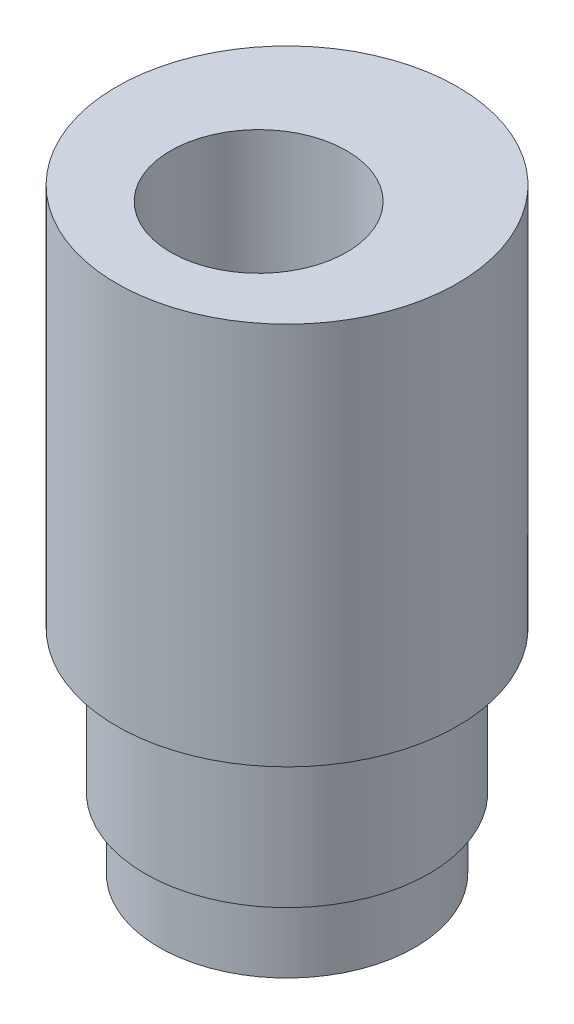
ISO-10303-21;
HEADER;
FILE_DESCRIPTION(('STEP AP214'),'2;1');
FILE_NAME('part.step','',(''),(''),'','','');
FILE_SCHEMA(('AUTOMOTIVE_DESIGN { 1 0 10303 214 1 1 1 1 }'));
ENDSEC;
DATA;
#1=APPLICATION_CONTEXT('core data for automotive mechanical design processes');
#2=APPLICATION_PROTOCOL_DEFINITION('international standard','automotive_design',2000,#1);
#3=PRODUCT_CONTEXT('',#1,'mechanical');
#4=PRODUCT('Part','Part','',(#3));
#5=PRODUCT_RELATED_PRODUCT_CATEGORY('part','',(#4));
#6=PRODUCT_DEFINITION_FORMATION('','',#4);
#7=PRODUCT_DEFINITION_CONTEXT('part definition',#1,'design');
#8=PRODUCT_DEFINITION('design','',#6,#7);
#9=PRODUCT_DEFINITION_SHAPE('','',#8);
#10=(LENGTH_UNIT() NAMED_UNIT(*) SI_UNIT(.MILLI.,.METRE.));
#11=(NAMED_UNIT(*) PLANE_ANGLE_UNIT() SI_UNIT($,.RADIAN.));
#12=(NAMED_UNIT(*) SI_UNIT($,.STERADIAN.) SOLID_ANGLE_UNIT());
#13=UNCERTAINTY_MEASURE_WITH_UNIT(LENGTH_MEASURE(1.E-05),#10,'distance_accuracy_value','');
#14=(GEOMETRIC_REPRESENTATION_CONTEXT(3) GLOBAL_UNCERTAINTY_ASSIGNED_CONTEXT((#13)) GLOBAL_UNIT_ASSIGNED_CONTEXT((#10,
#11,#12)) REPRESENTATION_CONTEXT('',''));
#15=CARTESIAN_POINT('',(0.,0.,0.));
#16=DIRECTION('',(0.,0.,1.));
#17=DIRECTION('',(1.,0.,0.));
#18=AXIS2_PLACEMENT_3D('',#15,#16,#17);
#19=CARTESIAN_POINT('',(0.,7.5,5.));
#20=DIRECTION('',(0.,1.,0.));
#21=DIRECTION('',(0.,0.,1.));
#22=AXIS2_PLACEMENT_3D('',#19,#20,#21);
#23=PLANE('',#22);
#24=CARTESIAN_POINT('',(0.,7.5,0.));
#25=DIRECTION('',(0.,-1.,0.));
#26=DIRECTION('',(0.,0.,-1.));
#27=AXIS2_PLACEMENT_3D('',#24,#25,#26);
#28=CIRCLE('',#27,5.);
#29=CARTESIAN_POINT('',(0.,7.5,-5.));
#30=VERTEX_POINT('',#29);
#31=EDGE_CURVE('E71',#30,#30,#28,.T.);
#32=ORIENTED_EDGE('',*,*,#31,.F.);
#33=EDGE_LOOP('',(#32));
#34=FACE_BOUND('',#33,.T.);
#35=CARTESIAN_POINT('',(0.,7.5,0.));
#36=DIRECTION('',(0.,-1.,0.));
#37=DIRECTION('',(0.,0.,-1.));
#38=AXIS2_PLACEMENT_3D('',#35,#36,#37);
#39=CIRCLE('',#38,5.99999999999999);
#40=CARTESIAN_POINT('',(0.,7.5,-5.99999999999999));
#41=VERTEX_POINT('',#40);
#42=EDGE_CURVE('E10',#41,#41,#39,.T.);
#43=ORIENTED_EDGE('',*,*,#42,.T.);
#44=EDGE_LOOP('',(#43));
#45=FACE_BOUND('',#44,.T.);
#46=ADVANCED_FACE('F44',(#34,#45),#23,.F.);
#47=CARTESIAN_POINT('',(0.,-43.5149122258906,0.));
#48=DIRECTION('',(0.,-1.,0.));
#49=DIRECTION('',(0.,0.,-1.));
#50=AXIS2_PLACEMENT_3D('',#47,#48,#49);
#51=CYLINDRICAL_SURFACE('',#50,5.99999999999999);
#52=ORIENTED_EDGE('',*,*,#42,.F.);
#53=EDGE_LOOP('',(#52));
#54=FACE_BOUND('',#53,.T.);
#55=CARTESIAN_POINT('',(0.,21.,0.));
#56=DIRECTION('',(0.,-1.,0.));
#57=DIRECTION('',(0.,0.,-1.));
#58=AXIS2_PLACEMENT_3D('',#55,#56,#57);
#59=CIRCLE('',#58,5.99999999999999);
#60=CARTESIAN_POINT('',(0.,21.,-5.99999999999999));
#61=VERTEX_POINT('',#60);
#62=EDGE_CURVE('E51',#61,#61,#59,.T.);
#63=ORIENTED_EDGE('',*,*,#62,.T.);
#64=EDGE_LOOP('',(#63));
#65=FACE_BOUND('',#64,.T.);
#66=ADVANCED_FACE('F118',(#54,#65),#51,.T.);
#67=CARTESIAN_POINT('',(0.,21.,5.99999999999999));
#68=DIRECTION('',(0.,-1.,0.));
#69=DIRECTION('',(0.,0.,-1.));
#70=AXIS2_PLACEMENT_3D('',#67,#68,#69);
#71=PLANE('',#70);
#72=CARTESIAN_POINT('',(0.,21.,1.));
#73=DIRECTION('',(0.,-1.,0.));
#74=DIRECTION('',(0.,0.,-1.));
#75=AXIS2_PLACEMENT_3D('',#72,#73,#74);
#76=CIRCLE('',#75,3.1);
#77=CARTESIAN_POINT('',(0.,21.,-2.1));
#78=VERTEX_POINT('',#77);
#79=EDGE_CURVE('E75',#78,#78,#76,.T.);
#80=ORIENTED_EDGE('',*,*,#79,.T.);
#81=EDGE_LOOP('',(#80));
#82=FACE_BOUND('',#81,.T.);
#83=ORIENTED_EDGE('',*,*,#62,.F.);
#84=EDGE_LOOP('',(#83));
#85=FACE_BOUND('',#84,.T.);
#86=ADVANCED_FACE('F84',(#82,#85),#71,.F.);
#87=CARTESIAN_POINT('',(0.,0.,0.));
#88=DIRECTION('',(0.,1.,0.));
#89=DIRECTION('',(0.,0.,1.));
#90=AXIS2_PLACEMENT_3D('',#87,#88,#89);
#91=PLANE('',#90);
#92=CARTESIAN_POINT('',(0.,0.,1.));
#93=DIRECTION('',(0.,-1.,0.));
#94=DIRECTION('',(0.,0.,-1.));
#95=AXIS2_PLACEMENT_3D('',#92,#93,#94);
#96=CIRCLE('',#95,3.1);
#97=CARTESIAN_POINT('',(0.,0.,-2.1));
#98=VERTEX_POINT('',#97);
#99=EDGE_CURVE('E76',#98,#98,#96,.T.);
#100=ORIENTED_EDGE('',*,*,#99,.F.);
#101=EDGE_LOOP('',(#100));
#102=FACE_BOUND('',#101,.T.);
#103=CARTESIAN_POINT('',(0.,0.,0.));
#104=DIRECTION('',(0.,-1.,0.));
#105=DIRECTION('',(0.,0.,-1.));
#106=AXIS2_PLACEMENT_3D('',#103,#104,#105);
#107=CIRCLE('',#106,4.5);
#108=CARTESIAN_POINT('',(0.,0.,-4.5));
#109=VERTEX_POINT('',#108);
#110=EDGE_CURVE('E56',#109,#109,#107,.T.);
#111=ORIENTED_EDGE('',*,*,#110,.T.);
#112=EDGE_LOOP('',(#111));
#113=FACE_BOUND('',#112,.T.);
#114=ADVANCED_FACE('F94',(#102,#113),#91,.F.);
#115=CARTESIAN_POINT('',(0.,-43.5149122258906,0.));
#116=DIRECTION('',(0.,-1.,0.));
#117=DIRECTION('',(0.,0.,-1.));
#118=AXIS2_PLACEMENT_3D('',#115,#116,#117);
#119=CYLINDRICAL_SURFACE('',#118,4.5);
#120=ORIENTED_EDGE('',*,*,#110,.F.);
#121=EDGE_LOOP('',(#120));
#122=FACE_BOUND('',#121,.T.);
#123=CARTESIAN_POINT('',(0.,2.5,0.));
#124=DIRECTION('',(0.,-1.,0.));
#125=DIRECTION('',(0.,0.,-1.));
#126=AXIS2_PLACEMENT_3D('',#123,#124,#125);
#127=CIRCLE('',#126,4.5);
#128=CARTESIAN_POINT('',(0.,2.5,-4.5));
#129=VERTEX_POINT('',#128);
#130=EDGE_CURVE('E61',#129,#129,#127,.T.);
#131=ORIENTED_EDGE('',*,*,#130,.T.);
#132=EDGE_LOOP('',(#131));
#133=FACE_BOUND('',#132,.T.);
#134=ADVANCED_FACE('F97',(#122,#133),#119,.T.);
#135=CARTESIAN_POINT('',(0.,2.5,4.5));
#136=DIRECTION('',(0.,1.,0.));
#137=DIRECTION('',(0.,0.,1.));
#138=AXIS2_PLACEMENT_3D('',#135,#136,#137);
#139=PLANE('',#138);
#140=ORIENTED_EDGE('',*,*,#130,.F.);
#141=EDGE_LOOP('',(#140));
#142=FACE_BOUND('',#141,.T.);
#143=CARTESIAN_POINT('',(0.,2.5,0.));
#144=DIRECTION('',(0.,-1.,0.));
#145=DIRECTION('',(0.,0.,-1.));
#146=AXIS2_PLACEMENT_3D('',#143,#144,#145);
#147=CIRCLE('',#146,5.);
#148=CARTESIAN_POINT('',(0.,2.5,-5.));
#149=VERTEX_POINT('',#148);
#150=EDGE_CURVE('E67',#149,#149,#147,.T.);
#151=ORIENTED_EDGE('',*,*,#150,.T.);
#152=EDGE_LOOP('',(#151));
#153=FACE_BOUND('',#152,.T.);
#154=ADVANCED_FACE('F103',(#142,#153),#139,.F.);
#155=CARTESIAN_POINT('',(0.,-43.5149122258906,0.));
#156=DIRECTION('',(0.,-1.,0.));
#157=DIRECTION('',(0.,0.,-1.));
#158=AXIS2_PLACEMENT_3D('',#155,#156,#157);
#159=CYLINDRICAL_SURFACE('',#158,5.);
#160=ORIENTED_EDGE('',*,*,#150,.F.);
#161=EDGE_LOOP('',(#160));
#162=FACE_BOUND('',#161,.T.);
#163=ORIENTED_EDGE('',*,*,#31,.T.);
#164=EDGE_LOOP('',(#163));
#165=FACE_BOUND('',#164,.T.);
#166=ADVANCED_FACE('F90',(#162,#165),#159,.T.);
#167=CARTESIAN_POINT('',(0.,21.,1.));
#168=DIRECTION('',(0.,-1.,0.));
#169=DIRECTION('',(0.,0.,-1.));
#170=AXIS2_PLACEMENT_3D('',#167,#168,#169);
#171=CYLINDRICAL_SURFACE('',#170,3.1);
#172=ORIENTED_EDGE('',*,*,#79,.F.);
#173=EDGE_LOOP('',(#172));
#174=FACE_BOUND('',#173,.T.);
#175=ORIENTED_EDGE('',*,*,#99,.T.);
#176=EDGE_LOOP('',(#175));
#177=FACE_BOUND('',#176,.T.);
#178=ADVANCED_FACE('F87',(#174,#177),#171,.F.);
#179=CLOSED_SHELL('',(#46,#66,#86,#114,#134,#154,#166,#178));
#180=MANIFOLD_SOLID_BREP('B2',#179);
#181=ADVANCED_BREP_SHAPE_REPRESENTATION('',(#18,#180),#14);
#182=SHAPE_DEFINITION_REPRESENTATION(#9,#181);
ENDSEC;
END-ISO-10303-21;
